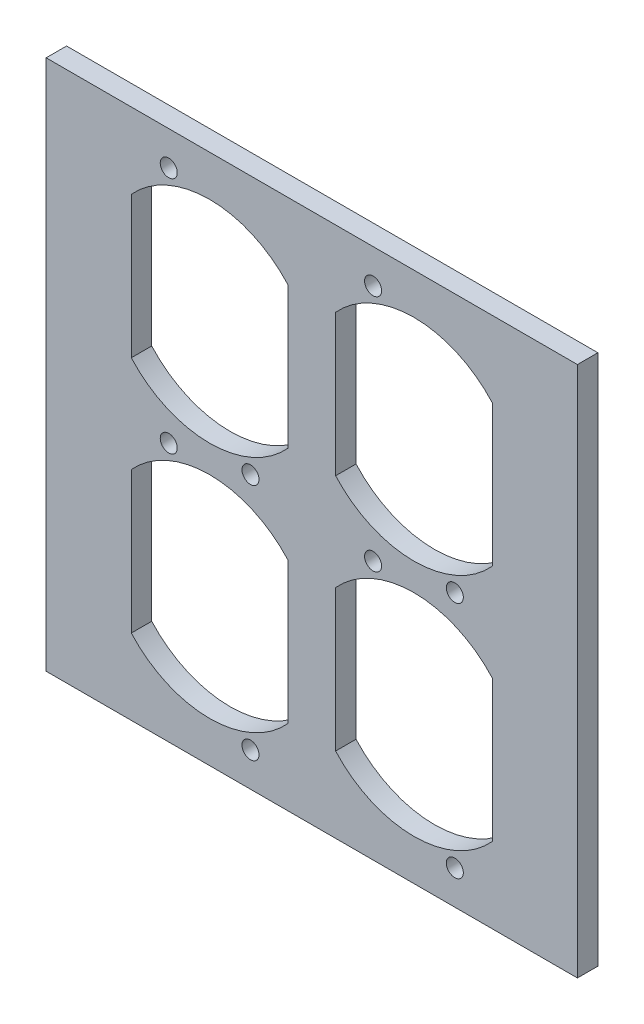
ISO-10303-21;
HEADER;
FILE_DESCRIPTION(('STEP AP214'),'2;1');
FILE_NAME('part.step','',(''),(''),'','','');
FILE_SCHEMA(('AUTOMOTIVE_DESIGN { 1 0 10303 214 1 1 1 1 }'));
ENDSEC;
DATA;
#1=APPLICATION_CONTEXT('core data for automotive mechanical design processes');
#2=APPLICATION_PROTOCOL_DEFINITION('international standard','automotive_design',2000,#1);
#3=PRODUCT_CONTEXT('',#1,'mechanical');
#4=PRODUCT('Part','Part','',(#3));
#5=PRODUCT_RELATED_PRODUCT_CATEGORY('part','',(#4));
#6=PRODUCT_DEFINITION_FORMATION('','',#4);
#7=PRODUCT_DEFINITION_CONTEXT('part definition',#1,'design');
#8=PRODUCT_DEFINITION('design','',#6,#7);
#9=PRODUCT_DEFINITION_SHAPE('','',#8);
#10=(LENGTH_UNIT() NAMED_UNIT(*) SI_UNIT(.MILLI.,.METRE.));
#11=(NAMED_UNIT(*) PLANE_ANGLE_UNIT() SI_UNIT($,.RADIAN.));
#12=(NAMED_UNIT(*) SI_UNIT($,.STERADIAN.) SOLID_ANGLE_UNIT());
#13=UNCERTAINTY_MEASURE_WITH_UNIT(LENGTH_MEASURE(1.E-05),#10,'distance_accuracy_value','');
#14=(GEOMETRIC_REPRESENTATION_CONTEXT(3) GLOBAL_UNCERTAINTY_ASSIGNED_CONTEXT((#13)) GLOBAL_UNIT_ASSIGNED_CONTEXT((#10,
#11,#12)) REPRESENTATION_CONTEXT('',''));
#15=CARTESIAN_POINT('',(0.,0.,0.));
#16=DIRECTION('',(0.,0.,1.));
#17=DIRECTION('',(1.,0.,0.));
#18=AXIS2_PLACEMENT_3D('',#15,#16,#17);
#19=CARTESIAN_POINT('',(39.,-39.,3.));
#20=DIRECTION('',(-1.,0.,0.));
#21=DIRECTION('',(0.,0.,1.));
#22=AXIS2_PLACEMENT_3D('',#19,#20,#21);
#23=PLANE('',#22);
#24=DIRECTION('',(0.,1.,0.));
#25=VECTOR('',#24,1.);
#26=CARTESIAN_POINT('',(39.,-39.,0.));
#27=LINE('',#26,#25);
#28=CARTESIAN_POINT('',(39.,-39.,0.));
#29=VERTEX_POINT('',#28);
#30=CARTESIAN_POINT('',(39.,39.,0.));
#31=VERTEX_POINT('',#30);
#32=EDGE_CURVE('E262',#29,#31,#27,.T.);
#33=ORIENTED_EDGE('',*,*,#32,.T.);
#34=DIRECTION('',(0.,0.,-1.));
#35=VECTOR('',#34,1.);
#36=CARTESIAN_POINT('',(39.,39.,3.));
#37=LINE('',#36,#35);
#38=CARTESIAN_POINT('',(39.,39.,3.));
#39=VERTEX_POINT('',#38);
#40=EDGE_CURVE('E295',#39,#31,#37,.T.);
#41=ORIENTED_EDGE('',*,*,#40,.F.);
#42=DIRECTION('',(0.,1.,0.));
#43=VECTOR('',#42,1.);
#44=CARTESIAN_POINT('',(39.,-39.,3.));
#45=LINE('',#44,#43);
#46=CARTESIAN_POINT('',(39.,-39.,3.));
#47=VERTEX_POINT('',#46);
#48=EDGE_CURVE('E269',#47,#39,#45,.T.);
#49=ORIENTED_EDGE('',*,*,#48,.F.);
#50=DIRECTION('',(0.,0.,-1.));
#51=VECTOR('',#50,1.);
#52=CARTESIAN_POINT('',(39.,-39.,3.));
#53=LINE('',#52,#51);
#54=EDGE_CURVE('E279',#47,#29,#53,.T.);
#55=ORIENTED_EDGE('',*,*,#54,.T.);
#56=EDGE_LOOP('',(#33,#41,#49,#55));
#57=FACE_BOUND('',#56,.T.);
#58=ADVANCED_FACE('F37',(#57),#23,.F.);
#59=CARTESIAN_POINT('',(-39.,39.,3.));
#60=DIRECTION('',(0.,-1.,0.));
#61=DIRECTION('',(0.,0.,-1.));
#62=AXIS2_PLACEMENT_3D('',#59,#60,#61);
#63=PLANE('',#62);
#64=DIRECTION('',(-1.,0.,0.));
#65=VECTOR('',#64,1.);
#66=CARTESIAN_POINT('',(-39.,39.,0.));
#67=LINE('',#66,#65);
#68=CARTESIAN_POINT('',(-39.,39.,0.));
#69=VERTEX_POINT('',#68);
#70=EDGE_CURVE('E282',#31,#69,#67,.T.);
#71=ORIENTED_EDGE('',*,*,#70,.T.);
#72=DIRECTION('',(0.,0.,-1.));
#73=VECTOR('',#72,1.);
#74=CARTESIAN_POINT('',(-39.,39.,3.));
#75=LINE('',#74,#73);
#76=CARTESIAN_POINT('',(-39.,39.,3.));
#77=VERTEX_POINT('',#76);
#78=EDGE_CURVE('E292',#77,#69,#75,.T.);
#79=ORIENTED_EDGE('',*,*,#78,.F.);
#80=DIRECTION('',(-1.,0.,0.));
#81=VECTOR('',#80,1.);
#82=CARTESIAN_POINT('',(-39.,39.,3.));
#83=LINE('',#82,#81);
#84=EDGE_CURVE('E272',#39,#77,#83,.T.);
#85=ORIENTED_EDGE('',*,*,#84,.F.);
#86=ORIENTED_EDGE('',*,*,#40,.T.);
#87=EDGE_LOOP('',(#71,#79,#85,#86));
#88=FACE_BOUND('',#87,.T.);
#89=ADVANCED_FACE('F377',(#88),#63,.F.);
#90=CARTESIAN_POINT('',(-39.,-39.,3.));
#91=DIRECTION('',(1.,0.,0.));
#92=DIRECTION('',(0.,0.,-1.));
#93=AXIS2_PLACEMENT_3D('',#90,#91,#92);
#94=PLANE('',#93);
#95=DIRECTION('',(0.,-1.,0.));
#96=VECTOR('',#95,1.);
#97=CARTESIAN_POINT('',(-39.,-39.,0.));
#98=LINE('',#97,#96);
#99=CARTESIAN_POINT('',(-39.,-39.,0.));
#100=VERTEX_POINT('',#99);
#101=EDGE_CURVE('E284',#69,#100,#98,.T.);
#102=ORIENTED_EDGE('',*,*,#101,.T.);
#103=DIRECTION('',(0.,0.,-1.));
#104=VECTOR('',#103,1.);
#105=CARTESIAN_POINT('',(-39.,-39.,3.));
#106=LINE('',#105,#104);
#107=CARTESIAN_POINT('',(-39.,-39.,3.));
#108=VERTEX_POINT('',#107);
#109=EDGE_CURVE('E289',#108,#100,#106,.T.);
#110=ORIENTED_EDGE('',*,*,#109,.F.);
#111=DIRECTION('',(0.,-1.,0.));
#112=VECTOR('',#111,1.);
#113=CARTESIAN_POINT('',(-39.,-39.,3.));
#114=LINE('',#113,#112);
#115=EDGE_CURVE('E275',#77,#108,#114,.T.);
#116=ORIENTED_EDGE('',*,*,#115,.F.);
#117=ORIENTED_EDGE('',*,*,#78,.T.);
#118=EDGE_LOOP('',(#102,#110,#116,#117));
#119=FACE_BOUND('',#118,.T.);
#120=ADVANCED_FACE('F383',(#119),#94,.F.);
#121=CARTESIAN_POINT('',(-39.,-39.,3.));
#122=DIRECTION('',(0.,1.,0.));
#123=DIRECTION('',(0.,0.,1.));
#124=AXIS2_PLACEMENT_3D('',#121,#122,#123);
#125=PLANE('',#124);
#126=DIRECTION('',(1.,0.,0.));
#127=VECTOR('',#126,1.);
#128=CARTESIAN_POINT('',(-39.,-39.,0.));
#129=LINE('',#128,#127);
#130=EDGE_CURVE('E273',#100,#29,#129,.T.);
#131=ORIENTED_EDGE('',*,*,#130,.T.);
#132=ORIENTED_EDGE('',*,*,#54,.F.);
#133=DIRECTION('',(1.,0.,0.));
#134=VECTOR('',#133,1.);
#135=CARTESIAN_POINT('',(-39.,-39.,3.));
#136=LINE('',#135,#134);
#137=EDGE_CURVE('E277',#108,#47,#136,.T.);
#138=ORIENTED_EDGE('',*,*,#137,.F.);
#139=ORIENTED_EDGE('',*,*,#109,.T.);
#140=EDGE_LOOP('',(#131,#132,#138,#139));
#141=FACE_BOUND('',#140,.T.);
#142=ADVANCED_FACE('F428',(#141),#125,.F.);
#143=CARTESIAN_POINT('',(0.,0.,3.));
#144=DIRECTION('',(0.,0.,-1.));
#145=DIRECTION('',(-1.,0.,0.));
#146=AXIS2_PLACEMENT_3D('',#143,#144,#145);
#147=PLANE('',#146);
#148=CARTESIAN_POINT('',(-21.,-1.,3.));
#149=DIRECTION('',(0.,0.,-1.));
#150=DIRECTION('',(-1.,0.,0.));
#151=AXIS2_PLACEMENT_3D('',#148,#149,#150);
#152=CIRCLE('',#151,1.25);
#153=CARTESIAN_POINT('',(-22.25,-1.,3.));
#154=VERTEX_POINT('',#153);
#155=EDGE_CURVE('E682',#154,#154,#152,.T.);
#156=ORIENTED_EDGE('',*,*,#155,.T.);
#157=EDGE_LOOP('',(#156));
#158=FACE_BOUND('',#157,.T.);
#159=CARTESIAN_POINT('',(-9.,-34.,3.));
#160=DIRECTION('',(0.,0.,-1.));
#161=DIRECTION('',(-1.,0.,0.));
#162=AXIS2_PLACEMENT_3D('',#159,#160,#161);
#163=CIRCLE('',#162,1.25);
#164=CARTESIAN_POINT('',(-10.25,-34.,3.));
#165=VERTEX_POINT('',#164);
#166=EDGE_CURVE('E689',#165,#165,#163,.T.);
#167=ORIENTED_EDGE('',*,*,#166,.T.);
#168=EDGE_LOOP('',(#167));
#169=FACE_BOUND('',#168,.T.);
#170=CARTESIAN_POINT('',(-21.,34.,3.));
#171=DIRECTION('',(0.,0.,-1.));
#172=DIRECTION('',(-1.,0.,0.));
#173=AXIS2_PLACEMENT_3D('',#170,#171,#172);
#174=CIRCLE('',#173,1.25);
#175=CARTESIAN_POINT('',(-22.25,34.,3.));
#176=VERTEX_POINT('',#175);
#177=EDGE_CURVE('E695',#176,#176,#174,.T.);
#178=ORIENTED_EDGE('',*,*,#177,.T.);
#179=EDGE_LOOP('',(#178));
#180=FACE_BOUND('',#179,.T.);
#181=CARTESIAN_POINT('',(-9.,1.,3.));
#182=DIRECTION('',(0.,0.,-1.));
#183=DIRECTION('',(-1.,0.,0.));
#184=AXIS2_PLACEMENT_3D('',#181,#182,#183);
#185=CIRCLE('',#184,1.25);
#186=CARTESIAN_POINT('',(-10.25,1.,3.));
#187=VERTEX_POINT('',#186);
#188=EDGE_CURVE('E701',#187,#187,#185,.T.);
#189=ORIENTED_EDGE('',*,*,#188,.T.);
#190=EDGE_LOOP('',(#189));
#191=FACE_BOUND('',#190,.T.);
#192=CARTESIAN_POINT('',(9.,-1.,3.));
#193=DIRECTION('',(0.,0.,-1.));
#194=DIRECTION('',(-1.,0.,0.));
#195=AXIS2_PLACEMENT_3D('',#192,#193,#194);
#196=CIRCLE('',#195,1.25);
#197=CARTESIAN_POINT('',(7.75,-1.,3.));
#198=VERTEX_POINT('',#197);
#199=EDGE_CURVE('E707',#198,#198,#196,.T.);
#200=ORIENTED_EDGE('',*,*,#199,.T.);
#201=EDGE_LOOP('',(#200));
#202=FACE_BOUND('',#201,.T.);
#203=CARTESIAN_POINT('',(21.,-34.,3.));
#204=DIRECTION('',(0.,0.,-1.));
#205=DIRECTION('',(-1.,0.,0.));
#206=AXIS2_PLACEMENT_3D('',#203,#204,#205);
#207=CIRCLE('',#206,1.25);
#208=CARTESIAN_POINT('',(19.75,-34.,3.));
#209=VERTEX_POINT('',#208);
#210=EDGE_CURVE('E188',#209,#209,#207,.T.);
#211=ORIENTED_EDGE('',*,*,#210,.T.);
#212=EDGE_LOOP('',(#211));
#213=FACE_BOUND('',#212,.T.);
#214=DIRECTION('',(0.,1.,0.));
#215=VECTOR('',#214,1.);
#216=CARTESIAN_POINT('',(-26.5,27.8923048454133,3.));
#217=LINE('',#216,#215);
#218=CARTESIAN_POINT('',(-26.5,7.10769515458674,3.));
#219=VERTEX_POINT('',#218);
#220=CARTESIAN_POINT('',(-26.5,27.8923048454133,3.));
#221=VERTEX_POINT('',#220);
#222=EDGE_CURVE('E211',#219,#221,#217,.T.);
#223=ORIENTED_EDGE('',*,*,#222,.T.);
#224=CARTESIAN_POINT('',(-15.,17.5,3.));
#225=DIRECTION('',(0.,0.,-1.));
#226=DIRECTION('',(1.,0.,0.));
#227=AXIS2_PLACEMENT_3D('',#224,#225,#226);
#228=CIRCLE('',#227,15.5);
#229=CARTESIAN_POINT('',(-3.5,27.8923048454133,3.));
#230=VERTEX_POINT('',#229);
#231=EDGE_CURVE('E217',#221,#230,#228,.T.);
#232=ORIENTED_EDGE('',*,*,#231,.T.);
#233=DIRECTION('',(0.,-1.,0.));
#234=VECTOR('',#233,1.);
#235=CARTESIAN_POINT('',(-3.5,27.8923048454133,3.));
#236=LINE('',#235,#234);
#237=CARTESIAN_POINT('',(-3.5,7.10769515458673,3.));
#238=VERTEX_POINT('',#237);
#239=EDGE_CURVE('E187',#230,#238,#236,.T.);
#240=ORIENTED_EDGE('',*,*,#239,.T.);
#241=CARTESIAN_POINT('',(-15.,17.5,3.));
#242=DIRECTION('',(0.,0.,-1.));
#243=DIRECTION('',(-1.,0.,0.));
#244=AXIS2_PLACEMENT_3D('',#241,#242,#243);
#245=CIRCLE('',#244,15.5);
#246=EDGE_CURVE('E195',#238,#219,#245,.T.);
#247=ORIENTED_EDGE('',*,*,#246,.T.);
#248=EDGE_LOOP('',(#223,#232,#240,#247));
#249=FACE_BOUND('',#248,.T.);
#250=CARTESIAN_POINT('',(9.,34.,3.));
#251=DIRECTION('',(0.,0.,-1.));
#252=DIRECTION('',(-1.,0.,0.));
#253=AXIS2_PLACEMENT_3D('',#250,#251,#252);
#254=CIRCLE('',#253,1.25);
#255=CARTESIAN_POINT('',(7.75,34.,3.));
#256=VERTEX_POINT('',#255);
#257=EDGE_CURVE('E221',#256,#256,#254,.T.);
#258=ORIENTED_EDGE('',*,*,#257,.T.);
#259=EDGE_LOOP('',(#258));
#260=FACE_BOUND('',#259,.T.);
#261=CARTESIAN_POINT('',(21.,1.,3.));
#262=DIRECTION('',(0.,0.,-1.));
#263=DIRECTION('',(-1.,0.,0.));
#264=AXIS2_PLACEMENT_3D('',#261,#262,#263);
#265=CIRCLE('',#264,1.25);
#266=CARTESIAN_POINT('',(19.75,1.,3.));
#267=VERTEX_POINT('',#266);
#268=EDGE_CURVE('E227',#267,#267,#265,.T.);
#269=ORIENTED_EDGE('',*,*,#268,.T.);
#270=EDGE_LOOP('',(#269));
#271=FACE_BOUND('',#270,.T.);
#272=DIRECTION('',(0.,1.,0.));
#273=VECTOR('',#272,1.);
#274=CARTESIAN_POINT('',(3.5,27.8923048454133,3.));
#275=LINE('',#274,#273);
#276=CARTESIAN_POINT('',(3.5,7.10769515458674,3.));
#277=VERTEX_POINT('',#276);
#278=CARTESIAN_POINT('',(3.5,27.8923048454133,3.));
#279=VERTEX_POINT('',#278);
#280=EDGE_CURVE('E245',#277,#279,#275,.T.);
#281=ORIENTED_EDGE('',*,*,#280,.T.);
#282=CARTESIAN_POINT('',(15.,17.5,3.));
#283=DIRECTION('',(0.,0.,-1.));
#284=DIRECTION('',(1.,0.,0.));
#285=AXIS2_PLACEMENT_3D('',#282,#283,#284);
#286=CIRCLE('',#285,15.5);
#287=CARTESIAN_POINT('',(26.5,27.8923048454133,3.));
#288=VERTEX_POINT('',#287);
#289=EDGE_CURVE('E233',#279,#288,#286,.T.);
#290=ORIENTED_EDGE('',*,*,#289,.T.);
#291=DIRECTION('',(0.,-1.,0.));
#292=VECTOR('',#291,1.);
#293=CARTESIAN_POINT('',(26.5,27.8923048454133,3.));
#294=LINE('',#293,#292);
#295=CARTESIAN_POINT('',(26.5,7.10769515458673,3.));
#296=VERTEX_POINT('',#295);
#297=EDGE_CURVE('E237',#288,#296,#294,.T.);
#298=ORIENTED_EDGE('',*,*,#297,.T.);
#299=CARTESIAN_POINT('',(15.,17.5,3.));
#300=DIRECTION('',(0.,0.,-1.));
#301=DIRECTION('',(-1.,0.,0.));
#302=AXIS2_PLACEMENT_3D('',#299,#300,#301);
#303=CIRCLE('',#302,15.5);
#304=EDGE_CURVE('E242',#296,#277,#303,.T.);
#305=ORIENTED_EDGE('',*,*,#304,.T.);
#306=EDGE_LOOP('',(#281,#290,#298,#305));
#307=FACE_BOUND('',#306,.T.);
#308=ORIENTED_EDGE('',*,*,#48,.T.);
#309=ORIENTED_EDGE('',*,*,#84,.T.);
#310=ORIENTED_EDGE('',*,*,#115,.T.);
#311=ORIENTED_EDGE('',*,*,#137,.T.);
#312=EDGE_LOOP('',(#308,#309,#310,#311));
#313=FACE_BOUND('',#312,.T.);
#314=CARTESIAN_POINT('',(15.,-17.5,3.));
#315=DIRECTION('',(0.,0.,-1.));
#316=DIRECTION('',(1.,0.,0.));
#317=AXIS2_PLACEMENT_3D('',#314,#315,#316);
#318=CIRCLE('',#317,15.5);
#319=CARTESIAN_POINT('',(3.5,-7.10769515458673,3.));
#320=VERTEX_POINT('',#319);
#321=CARTESIAN_POINT('',(26.5,-7.10769515458674,3.));
#322=VERTEX_POINT('',#321);
#323=EDGE_CURVE('E309',#320,#322,#318,.T.);
#324=ORIENTED_EDGE('',*,*,#323,.T.);
#325=DIRECTION('',(0.,-1.,0.));
#326=VECTOR('',#325,1.);
#327=CARTESIAN_POINT('',(26.5,-7.10769515458674,3.));
#328=LINE('',#327,#326);
#329=CARTESIAN_POINT('',(26.5,-27.8923048454133,3.));
#330=VERTEX_POINT('',#329);
#331=EDGE_CURVE('E311',#322,#330,#328,.T.);
#332=ORIENTED_EDGE('',*,*,#331,.T.);
#333=CARTESIAN_POINT('',(15.,-17.5,3.));
#334=DIRECTION('',(0.,0.,-1.));
#335=DIRECTION('',(-1.,0.,0.));
#336=AXIS2_PLACEMENT_3D('',#333,#334,#335);
#337=CIRCLE('',#336,15.5);
#338=CARTESIAN_POINT('',(3.5,-27.8923048454133,3.));
#339=VERTEX_POINT('',#338);
#340=EDGE_CURVE('E313',#330,#339,#337,.T.);
#341=ORIENTED_EDGE('',*,*,#340,.T.);
#342=DIRECTION('',(0.,1.,0.));
#343=VECTOR('',#342,1.);
#344=CARTESIAN_POINT('',(3.5,-7.10769515458673,3.));
#345=LINE('',#344,#343);
#346=EDGE_CURVE('E315',#339,#320,#345,.T.);
#347=ORIENTED_EDGE('',*,*,#346,.T.);
#348=EDGE_LOOP('',(#324,#332,#341,#347));
#349=FACE_BOUND('',#348,.T.);
#350=CARTESIAN_POINT('',(-15.,-17.5,3.));
#351=DIRECTION('',(0.,0.,-1.));
#352=DIRECTION('',(1.,0.,0.));
#353=AXIS2_PLACEMENT_3D('',#350,#351,#352);
#354=CIRCLE('',#353,15.5);
#355=CARTESIAN_POINT('',(-26.5,-7.10769515458673,3.));
#356=VERTEX_POINT('',#355);
#357=CARTESIAN_POINT('',(-3.5,-7.10769515458674,3.));
#358=VERTEX_POINT('',#357);
#359=EDGE_CURVE('E52',#356,#358,#354,.T.);
#360=ORIENTED_EDGE('',*,*,#359,.T.);
#361=DIRECTION('',(0.,-1.,0.));
#362=VECTOR('',#361,1.);
#363=CARTESIAN_POINT('',(-3.5,-7.10769515458674,3.));
#364=LINE('',#363,#362);
#365=CARTESIAN_POINT('',(-3.5,-27.8923048454133,3.));
#366=VERTEX_POINT('',#365);
#367=EDGE_CURVE('E342',#358,#366,#364,.T.);
#368=ORIENTED_EDGE('',*,*,#367,.T.);
#369=CARTESIAN_POINT('',(-15.,-17.5,3.));
#370=DIRECTION('',(0.,0.,-1.));
#371=DIRECTION('',(-1.,0.,0.));
#372=AXIS2_PLACEMENT_3D('',#369,#370,#371);
#373=CIRCLE('',#372,15.5);
#374=CARTESIAN_POINT('',(-26.5,-27.8923048454133,3.));
#375=VERTEX_POINT('',#374);
#376=EDGE_CURVE('E59',#366,#375,#373,.T.);
#377=ORIENTED_EDGE('',*,*,#376,.T.);
#378=DIRECTION('',(0.,1.,0.));
#379=VECTOR('',#378,1.);
#380=CARTESIAN_POINT('',(-26.5,-7.10769515458673,3.));
#381=LINE('',#380,#379);
#382=EDGE_CURVE('E345',#375,#356,#381,.T.);
#383=ORIENTED_EDGE('',*,*,#382,.T.);
#384=EDGE_LOOP('',(#360,#368,#377,#383));
#385=FACE_BOUND('',#384,.T.);
#386=ADVANCED_FACE('F415',(#158,#169,#180,#191,#202,#213,#249,#260,#271,#307,#313,#349,#385),
#147,.F.);
#387=CARTESIAN_POINT('',(0.,0.,0.));
#388=DIRECTION('',(0.,0.,-1.));
#389=DIRECTION('',(-1.,0.,0.));
#390=AXIS2_PLACEMENT_3D('',#387,#388,#389);
#391=PLANE('',#390);
#392=CARTESIAN_POINT('',(-21.,-1.,0.));
#393=DIRECTION('',(0.,0.,-1.));
#394=DIRECTION('',(-1.,0.,0.));
#395=AXIS2_PLACEMENT_3D('',#392,#393,#394);
#396=CIRCLE('',#395,1.25);
#397=CARTESIAN_POINT('',(-22.25,-1.,0.));
#398=VERTEX_POINT('',#397);
#399=EDGE_CURVE('E684',#398,#398,#396,.T.);
#400=ORIENTED_EDGE('',*,*,#399,.F.);
#401=EDGE_LOOP('',(#400));
#402=FACE_BOUND('',#401,.T.);
#403=CARTESIAN_POINT('',(-9.,-34.,0.));
#404=DIRECTION('',(0.,0.,-1.));
#405=DIRECTION('',(-1.,0.,0.));
#406=AXIS2_PLACEMENT_3D('',#403,#404,#405);
#407=CIRCLE('',#406,1.25);
#408=CARTESIAN_POINT('',(-10.25,-34.,0.));
#409=VERTEX_POINT('',#408);
#410=EDGE_CURVE('E686',#409,#409,#407,.T.);
#411=ORIENTED_EDGE('',*,*,#410,.F.);
#412=EDGE_LOOP('',(#411));
#413=FACE_BOUND('',#412,.T.);
#414=CARTESIAN_POINT('',(-21.,34.,0.));
#415=DIRECTION('',(0.,0.,-1.));
#416=DIRECTION('',(-1.,0.,0.));
#417=AXIS2_PLACEMENT_3D('',#414,#415,#416);
#418=CIRCLE('',#417,1.25);
#419=CARTESIAN_POINT('',(-22.25,34.,0.));
#420=VERTEX_POINT('',#419);
#421=EDGE_CURVE('E692',#420,#420,#418,.T.);
#422=ORIENTED_EDGE('',*,*,#421,.F.);
#423=EDGE_LOOP('',(#422));
#424=FACE_BOUND('',#423,.T.);
#425=CARTESIAN_POINT('',(-9.,1.,0.));
#426=DIRECTION('',(0.,0.,-1.));
#427=DIRECTION('',(-1.,0.,0.));
#428=AXIS2_PLACEMENT_3D('',#425,#426,#427);
#429=CIRCLE('',#428,1.25);
#430=CARTESIAN_POINT('',(-10.25,1.,0.));
#431=VERTEX_POINT('',#430);
#432=EDGE_CURVE('E698',#431,#431,#429,.T.);
#433=ORIENTED_EDGE('',*,*,#432,.F.);
#434=EDGE_LOOP('',(#433));
#435=FACE_BOUND('',#434,.T.);
#436=CARTESIAN_POINT('',(9.,-1.,0.));
#437=DIRECTION('',(0.,0.,-1.));
#438=DIRECTION('',(-1.,0.,0.));
#439=AXIS2_PLACEMENT_3D('',#436,#437,#438);
#440=CIRCLE('',#439,1.25);
#441=CARTESIAN_POINT('',(7.75,-1.,0.));
#442=VERTEX_POINT('',#441);
#443=EDGE_CURVE('E704',#442,#442,#440,.T.);
#444=ORIENTED_EDGE('',*,*,#443,.F.);
#445=EDGE_LOOP('',(#444));
#446=FACE_BOUND('',#445,.T.);
#447=CARTESIAN_POINT('',(21.,-34.,0.));
#448=DIRECTION('',(0.,0.,-1.));
#449=DIRECTION('',(-1.,0.,0.));
#450=AXIS2_PLACEMENT_3D('',#447,#448,#449);
#451=CIRCLE('',#450,1.25);
#452=CARTESIAN_POINT('',(19.75,-34.,0.));
#453=VERTEX_POINT('',#452);
#454=EDGE_CURVE('E710',#453,#453,#451,.T.);
#455=ORIENTED_EDGE('',*,*,#454,.F.);
#456=EDGE_LOOP('',(#455));
#457=FACE_BOUND('',#456,.T.);
#458=CARTESIAN_POINT('',(-15.,17.5,0.));
#459=DIRECTION('',(0.,0.,-1.));
#460=DIRECTION('',(1.,0.,0.));
#461=AXIS2_PLACEMENT_3D('',#458,#459,#460);
#462=CIRCLE('',#461,15.5);
#463=CARTESIAN_POINT('',(-26.5,27.8923048454133,0.));
#464=VERTEX_POINT('',#463);
#465=CARTESIAN_POINT('',(-3.5,27.8923048454133,0.));
#466=VERTEX_POINT('',#465);
#467=EDGE_CURVE('E214',#464,#466,#462,.T.);
#468=ORIENTED_EDGE('',*,*,#467,.F.);
#469=DIRECTION('',(0.,1.,0.));
#470=VECTOR('',#469,1.);
#471=CARTESIAN_POINT('',(-26.5,27.8923048454133,0.));
#472=LINE('',#471,#470);
#473=CARTESIAN_POINT('',(-26.5,7.10769515458674,0.));
#474=VERTEX_POINT('',#473);
#475=EDGE_CURVE('E200',#474,#464,#472,.T.);
#476=ORIENTED_EDGE('',*,*,#475,.F.);
#477=CARTESIAN_POINT('',(-15.,17.5,0.));
#478=DIRECTION('',(0.,0.,-1.));
#479=DIRECTION('',(-1.,0.,0.));
#480=AXIS2_PLACEMENT_3D('',#477,#478,#479);
#481=CIRCLE('',#480,15.5);
#482=CARTESIAN_POINT('',(-3.5,7.10769515458673,0.));
#483=VERTEX_POINT('',#482);
#484=EDGE_CURVE('E192',#483,#474,#481,.T.);
#485=ORIENTED_EDGE('',*,*,#484,.F.);
#486=DIRECTION('',(0.,-1.,0.));
#487=VECTOR('',#486,1.);
#488=CARTESIAN_POINT('',(-3.5,27.8923048454133,0.));
#489=LINE('',#488,#487);
#490=EDGE_CURVE('E176',#466,#483,#489,.T.);
#491=ORIENTED_EDGE('',*,*,#490,.F.);
#492=EDGE_LOOP('',(#468,#476,#485,#491));
#493=FACE_BOUND('',#492,.T.);
#494=CARTESIAN_POINT('',(9.,34.,0.));
#495=DIRECTION('',(0.,0.,-1.));
#496=DIRECTION('',(-1.,0.,0.));
#497=AXIS2_PLACEMENT_3D('',#494,#495,#496);
#498=CIRCLE('',#497,1.25);
#499=CARTESIAN_POINT('',(7.75,34.,0.));
#500=VERTEX_POINT('',#499);
#501=EDGE_CURVE('E220',#500,#500,#498,.T.);
#502=ORIENTED_EDGE('',*,*,#501,.F.);
#503=EDGE_LOOP('',(#502));
#504=FACE_BOUND('',#503,.T.);
#505=CARTESIAN_POINT('',(21.,1.,0.));
#506=DIRECTION('',(0.,0.,-1.));
#507=DIRECTION('',(-1.,0.,0.));
#508=AXIS2_PLACEMENT_3D('',#505,#506,#507);
#509=CIRCLE('',#508,1.25);
#510=CARTESIAN_POINT('',(19.75,1.,0.));
#511=VERTEX_POINT('',#510);
#512=EDGE_CURVE('E224',#511,#511,#509,.T.);
#513=ORIENTED_EDGE('',*,*,#512,.F.);
#514=EDGE_LOOP('',(#513));
#515=FACE_BOUND('',#514,.T.);
#516=CARTESIAN_POINT('',(15.,17.5,0.));
#517=DIRECTION('',(0.,0.,-1.));
#518=DIRECTION('',(1.,0.,0.));
#519=AXIS2_PLACEMENT_3D('',#516,#517,#518);
#520=CIRCLE('',#519,15.5);
#521=CARTESIAN_POINT('',(3.5,27.8923048454133,0.));
#522=VERTEX_POINT('',#521);
#523=CARTESIAN_POINT('',(26.5,27.8923048454133,0.));
#524=VERTEX_POINT('',#523);
#525=EDGE_CURVE('E230',#522,#524,#520,.T.);
#526=ORIENTED_EDGE('',*,*,#525,.F.);
#527=DIRECTION('',(0.,1.,0.));
#528=VECTOR('',#527,1.);
#529=CARTESIAN_POINT('',(3.5,27.8923048454133,0.));
#530=LINE('',#529,#528);
#531=CARTESIAN_POINT('',(3.5,7.10769515458674,0.));
#532=VERTEX_POINT('',#531);
#533=EDGE_CURVE('E238',#532,#522,#530,.T.);
#534=ORIENTED_EDGE('',*,*,#533,.F.);
#535=CARTESIAN_POINT('',(15.,17.5,0.));
#536=DIRECTION('',(0.,0.,-1.));
#537=DIRECTION('',(-1.,0.,0.));
#538=AXIS2_PLACEMENT_3D('',#535,#536,#537);
#539=CIRCLE('',#538,15.5);
#540=CARTESIAN_POINT('',(26.5,7.10769515458673,0.));
#541=VERTEX_POINT('',#540);
#542=EDGE_CURVE('E254',#541,#532,#539,.T.);
#543=ORIENTED_EDGE('',*,*,#542,.F.);
#544=DIRECTION('',(0.,-1.,0.));
#545=VECTOR('',#544,1.);
#546=CARTESIAN_POINT('',(26.5,27.8923048454133,0.));
#547=LINE('',#546,#545);
#548=EDGE_CURVE('E251',#524,#541,#547,.T.);
#549=ORIENTED_EDGE('',*,*,#548,.F.);
#550=EDGE_LOOP('',(#526,#534,#543,#549));
#551=FACE_BOUND('',#550,.T.);
#552=ORIENTED_EDGE('',*,*,#32,.F.);
#553=ORIENTED_EDGE('',*,*,#130,.F.);
#554=ORIENTED_EDGE('',*,*,#101,.F.);
#555=ORIENTED_EDGE('',*,*,#70,.F.);
#556=EDGE_LOOP('',(#552,#553,#554,#555));
#557=FACE_BOUND('',#556,.T.);
#558=CARTESIAN_POINT('',(15.,-17.5,0.));
#559=DIRECTION('',(0.,0.,-1.));
#560=DIRECTION('',(1.,0.,0.));
#561=AXIS2_PLACEMENT_3D('',#558,#559,#560);
#562=CIRCLE('',#561,15.5);
#563=CARTESIAN_POINT('',(3.5,-7.10769515458673,0.));
#564=VERTEX_POINT('',#563);
#565=CARTESIAN_POINT('',(26.5,-7.10769515458674,0.));
#566=VERTEX_POINT('',#565);
#567=EDGE_CURVE('E298',#564,#566,#562,.T.);
#568=ORIENTED_EDGE('',*,*,#567,.F.);
#569=DIRECTION('',(0.,1.,0.));
#570=VECTOR('',#569,1.);
#571=CARTESIAN_POINT('',(3.5,-7.10769515458673,0.));
#572=LINE('',#571,#570);
#573=CARTESIAN_POINT('',(3.5,-27.8923048454133,0.));
#574=VERTEX_POINT('',#573);
#575=EDGE_CURVE('E300',#574,#564,#572,.T.);
#576=ORIENTED_EDGE('',*,*,#575,.F.);
#577=CARTESIAN_POINT('',(15.,-17.5,0.));
#578=DIRECTION('',(0.,0.,-1.));
#579=DIRECTION('',(-1.,0.,0.));
#580=AXIS2_PLACEMENT_3D('',#577,#578,#579);
#581=CIRCLE('',#580,15.5);
#582=CARTESIAN_POINT('',(26.5,-27.8923048454133,0.));
#583=VERTEX_POINT('',#582);
#584=EDGE_CURVE('E303',#583,#574,#581,.T.);
#585=ORIENTED_EDGE('',*,*,#584,.F.);
#586=DIRECTION('',(0.,-1.,0.));
#587=VECTOR('',#586,1.);
#588=CARTESIAN_POINT('',(26.5,-7.10769515458674,0.));
#589=LINE('',#588,#587);
#590=EDGE_CURVE('E306',#566,#583,#589,.T.);
#591=ORIENTED_EDGE('',*,*,#590,.F.);
#592=EDGE_LOOP('',(#568,#576,#585,#591));
#593=FACE_BOUND('',#592,.T.);
#594=CARTESIAN_POINT('',(-15.,-17.5,0.));
#595=DIRECTION('',(0.,0.,-1.));
#596=DIRECTION('',(1.,0.,0.));
#597=AXIS2_PLACEMENT_3D('',#594,#595,#596);
#598=CIRCLE('',#597,15.5);
#599=CARTESIAN_POINT('',(-26.5,-7.10769515458673,0.));
#600=VERTEX_POINT('',#599);
#601=CARTESIAN_POINT('',(-3.5,-7.10769515458674,0.));
#602=VERTEX_POINT('',#601);
#603=EDGE_CURVE('E330',#600,#602,#598,.T.);
#604=ORIENTED_EDGE('',*,*,#603,.F.);
#605=DIRECTION('',(0.,1.,0.));
#606=VECTOR('',#605,1.);
#607=CARTESIAN_POINT('',(-26.5,-7.10769515458673,0.));
#608=LINE('',#607,#606);
#609=CARTESIAN_POINT('',(-26.5,-27.8923048454133,0.));
#610=VERTEX_POINT('',#609);
#611=EDGE_CURVE('E332',#610,#600,#608,.T.);
#612=ORIENTED_EDGE('',*,*,#611,.F.);
#613=CARTESIAN_POINT('',(-15.,-17.5,0.));
#614=DIRECTION('',(0.,0.,-1.));
#615=DIRECTION('',(-1.,0.,0.));
#616=AXIS2_PLACEMENT_3D('',#613,#614,#615);
#617=CIRCLE('',#616,15.5);
#618=CARTESIAN_POINT('',(-3.5,-27.8923048454133,0.));
#619=VERTEX_POINT('',#618);
#620=EDGE_CURVE('E335',#619,#610,#617,.T.);
#621=ORIENTED_EDGE('',*,*,#620,.F.);
#622=DIRECTION('',(0.,-1.,0.));
#623=VECTOR('',#622,1.);
#624=CARTESIAN_POINT('',(-3.5,-7.10769515458674,0.));
#625=LINE('',#624,#623);
#626=EDGE_CURVE('E338',#602,#619,#625,.T.);
#627=ORIENTED_EDGE('',*,*,#626,.F.);
#628=EDGE_LOOP('',(#604,#612,#621,#627));
#629=FACE_BOUND('',#628,.T.);
#630=ADVANCED_FACE('F198',(#402,#413,#424,#435,#446,#457,#493,#504,#515,#551,#557,#593,#629),
#391,.T.);
#631=CARTESIAN_POINT('',(15.,17.5,3.));
#632=DIRECTION('',(0.,0.,-1.));
#633=DIRECTION('',(-1.,0.,0.));
#634=AXIS2_PLACEMENT_3D('',#631,#632,#633);
#635=CYLINDRICAL_SURFACE('',#634,15.5);
#636=ORIENTED_EDGE('',*,*,#525,.T.);
#637=DIRECTION('',(0.,0.,-1.));
#638=VECTOR('',#637,1.);
#639=CARTESIAN_POINT('',(26.5,27.8923048454133,3.));
#640=LINE('',#639,#638);
#641=EDGE_CURVE('E249',#288,#524,#640,.T.);
#642=ORIENTED_EDGE('',*,*,#641,.F.);
#643=ORIENTED_EDGE('',*,*,#289,.F.);
#644=DIRECTION('',(0.,0.,-1.));
#645=VECTOR('',#644,1.);
#646=CARTESIAN_POINT('',(3.5,27.8923048454133,3.));
#647=LINE('',#646,#645);
#648=EDGE_CURVE('E260',#279,#522,#647,.T.);
#649=ORIENTED_EDGE('',*,*,#648,.T.);
#650=EDGE_LOOP('',(#636,#642,#643,#649));
#651=FACE_BOUND('',#650,.T.);
#652=ADVANCED_FACE('F418',(#651),#635,.F.);
#653=CARTESIAN_POINT('',(3.5,27.8923048454133,3.));
#654=DIRECTION('',(-1.,0.,0.));
#655=DIRECTION('',(0.,0.,1.));
#656=AXIS2_PLACEMENT_3D('',#653,#654,#655);
#657=PLANE('',#656);
#658=ORIENTED_EDGE('',*,*,#533,.T.);
#659=ORIENTED_EDGE('',*,*,#648,.F.);
#660=ORIENTED_EDGE('',*,*,#280,.F.);
#661=DIRECTION('',(0.,0.,-1.));
#662=VECTOR('',#661,1.);
#663=CARTESIAN_POINT('',(3.5,7.10769515458674,3.));
#664=LINE('',#663,#662);
#665=EDGE_CURVE('E263',#277,#532,#664,.T.);
#666=ORIENTED_EDGE('',*,*,#665,.T.);
#667=EDGE_LOOP('',(#658,#659,#660,#666));
#668=FACE_BOUND('',#667,.T.);
#669=ADVANCED_FACE('F425',(#668),#657,.F.);
#670=CARTESIAN_POINT('',(15.,17.5,3.));
#671=DIRECTION('',(0.,0.,-1.));
#672=DIRECTION('',(-1.,0.,0.));
#673=AXIS2_PLACEMENT_3D('',#670,#671,#672);
#674=CYLINDRICAL_SURFACE('',#673,15.5);
#675=ORIENTED_EDGE('',*,*,#542,.T.);
#676=ORIENTED_EDGE('',*,*,#665,.F.);
#677=ORIENTED_EDGE('',*,*,#304,.F.);
#678=DIRECTION('',(0.,0.,-1.));
#679=VECTOR('',#678,1.);
#680=CARTESIAN_POINT('',(26.5,7.10769515458673,3.));
#681=LINE('',#680,#679);
#682=EDGE_CURVE('E265',#296,#541,#681,.T.);
#683=ORIENTED_EDGE('',*,*,#682,.T.);
#684=EDGE_LOOP('',(#675,#676,#677,#683));
#685=FACE_BOUND('',#684,.T.);
#686=ADVANCED_FACE('F623',(#685),#674,.F.);
#687=CARTESIAN_POINT('',(26.5,27.8923048454133,3.));
#688=DIRECTION('',(1.,0.,0.));
#689=DIRECTION('',(0.,0.,-1.));
#690=AXIS2_PLACEMENT_3D('',#687,#688,#689);
#691=PLANE('',#690);
#692=ORIENTED_EDGE('',*,*,#548,.T.);
#693=ORIENTED_EDGE('',*,*,#682,.F.);
#694=ORIENTED_EDGE('',*,*,#297,.F.);
#695=ORIENTED_EDGE('',*,*,#641,.T.);
#696=EDGE_LOOP('',(#692,#693,#694,#695));
#697=FACE_BOUND('',#696,.T.);
#698=ADVANCED_FACE('F619',(#697),#691,.F.);
#699=CARTESIAN_POINT('',(21.,1.,3.));
#700=DIRECTION('',(0.,0.,-1.));
#701=DIRECTION('',(-1.,0.,0.));
#702=AXIS2_PLACEMENT_3D('',#699,#700,#701);
#703=CYLINDRICAL_SURFACE('',#702,1.25);
#704=ORIENTED_EDGE('',*,*,#268,.F.);
#705=EDGE_LOOP('',(#704));
#706=FACE_BOUND('',#705,.T.);
#707=ORIENTED_EDGE('',*,*,#512,.T.);
#708=EDGE_LOOP('',(#707));
#709=FACE_BOUND('',#708,.T.);
#710=ADVANCED_FACE('F615',(#706,#709),#703,.F.);
#711=CARTESIAN_POINT('',(9.,34.,3.));
#712=DIRECTION('',(0.,0.,-1.));
#713=DIRECTION('',(-1.,0.,0.));
#714=AXIS2_PLACEMENT_3D('',#711,#712,#713);
#715=CYLINDRICAL_SURFACE('',#714,1.25);
#716=ORIENTED_EDGE('',*,*,#257,.F.);
#717=EDGE_LOOP('',(#716));
#718=FACE_BOUND('',#717,.T.);
#719=ORIENTED_EDGE('',*,*,#501,.T.);
#720=EDGE_LOOP('',(#719));
#721=FACE_BOUND('',#720,.T.);
#722=ADVANCED_FACE('F480',(#718,#721),#715,.F.);
#723=CARTESIAN_POINT('',(-15.,17.5,3.));
#724=DIRECTION('',(0.,0.,-1.));
#725=DIRECTION('',(-1.,0.,0.));
#726=AXIS2_PLACEMENT_3D('',#723,#724,#725);
#727=CYLINDRICAL_SURFACE('',#726,15.5);
#728=ORIENTED_EDGE('',*,*,#467,.T.);
#729=DIRECTION('',(0.,0.,-1.));
#730=VECTOR('',#729,1.);
#731=CARTESIAN_POINT('',(-3.5,27.8923048454133,3.));
#732=LINE('',#731,#730);
#733=EDGE_CURVE('E182',#230,#466,#732,.T.);
#734=ORIENTED_EDGE('',*,*,#733,.F.);
#735=ORIENTED_EDGE('',*,*,#231,.F.);
#736=DIRECTION('',(0.,0.,-1.));
#737=VECTOR('',#736,1.);
#738=CARTESIAN_POINT('',(-26.5,27.8923048454133,3.));
#739=LINE('',#738,#737);
#740=EDGE_CURVE('E208',#221,#464,#739,.T.);
#741=ORIENTED_EDGE('',*,*,#740,.T.);
#742=EDGE_LOOP('',(#728,#734,#735,#741));
#743=FACE_BOUND('',#742,.T.);
#744=ADVANCED_FACE('F474',(#743),#727,.F.);
#745=CARTESIAN_POINT('',(-26.5,27.8923048454133,3.));
#746=DIRECTION('',(-1.,0.,0.));
#747=DIRECTION('',(0.,0.,1.));
#748=AXIS2_PLACEMENT_3D('',#745,#746,#747);
#749=PLANE('',#748);
#750=ORIENTED_EDGE('',*,*,#475,.T.);
#751=ORIENTED_EDGE('',*,*,#740,.F.);
#752=ORIENTED_EDGE('',*,*,#222,.F.);
#753=DIRECTION('',(0.,0.,-1.));
#754=VECTOR('',#753,1.);
#755=CARTESIAN_POINT('',(-26.5,7.10769515458674,3.));
#756=LINE('',#755,#754);
#757=EDGE_CURVE('E201',#219,#474,#756,.T.);
#758=ORIENTED_EDGE('',*,*,#757,.T.);
#759=EDGE_LOOP('',(#750,#751,#752,#758));
#760=FACE_BOUND('',#759,.T.);
#761=ADVANCED_FACE('F479',(#760),#749,.F.);
#762=CARTESIAN_POINT('',(-15.,17.5,3.));
#763=DIRECTION('',(0.,0.,-1.));
#764=DIRECTION('',(-1.,0.,0.));
#765=AXIS2_PLACEMENT_3D('',#762,#763,#764);
#766=CYLINDRICAL_SURFACE('',#765,15.5);
#767=ORIENTED_EDGE('',*,*,#484,.T.);
#768=ORIENTED_EDGE('',*,*,#757,.F.);
#769=ORIENTED_EDGE('',*,*,#246,.F.);
#770=DIRECTION('',(0.,0.,-1.));
#771=VECTOR('',#770,1.);
#772=CARTESIAN_POINT('',(-3.5,7.10769515458673,3.));
#773=LINE('',#772,#771);
#774=EDGE_CURVE('E179',#238,#483,#773,.T.);
#775=ORIENTED_EDGE('',*,*,#774,.T.);
#776=EDGE_LOOP('',(#767,#768,#769,#775));
#777=FACE_BOUND('',#776,.T.);
#778=ADVANCED_FACE('F191',(#777),#766,.F.);
#779=CARTESIAN_POINT('',(-3.5,27.8923048454133,3.));
#780=DIRECTION('',(1.,0.,0.));
#781=DIRECTION('',(0.,0.,-1.));
#782=AXIS2_PLACEMENT_3D('',#779,#780,#781);
#783=PLANE('',#782);
#784=ORIENTED_EDGE('',*,*,#490,.T.);
#785=ORIENTED_EDGE('',*,*,#774,.F.);
#786=ORIENTED_EDGE('',*,*,#239,.F.);
#787=ORIENTED_EDGE('',*,*,#733,.T.);
#788=EDGE_LOOP('',(#784,#785,#786,#787));
#789=FACE_BOUND('',#788,.T.);
#790=ADVANCED_FACE('F178',(#789),#783,.F.);
#791=CARTESIAN_POINT('',(26.5,-7.10769515458674,3.));
#792=DIRECTION('',(1.,0.,0.));
#793=DIRECTION('',(0.,0.,-1.));
#794=AXIS2_PLACEMENT_3D('',#791,#792,#793);
#795=PLANE('',#794);
#796=ORIENTED_EDGE('',*,*,#590,.T.);
#797=DIRECTION('',(0.,0.,-1.));
#798=VECTOR('',#797,1.);
#799=CARTESIAN_POINT('',(26.5,-27.8923048454133,3.));
#800=LINE('',#799,#798);
#801=EDGE_CURVE('E327',#330,#583,#800,.T.);
#802=ORIENTED_EDGE('',*,*,#801,.F.);
#803=ORIENTED_EDGE('',*,*,#331,.F.);
#804=DIRECTION('',(0.,0.,-1.));
#805=VECTOR('',#804,1.);
#806=CARTESIAN_POINT('',(26.5,-7.10769515458674,3.));
#807=LINE('',#806,#805);
#808=EDGE_CURVE('E318',#322,#566,#807,.T.);
#809=ORIENTED_EDGE('',*,*,#808,.T.);
#810=EDGE_LOOP('',(#796,#802,#803,#809));
#811=FACE_BOUND('',#810,.T.);
#812=ADVANCED_FACE('F398',(#811),#795,.F.);
#813=CARTESIAN_POINT('',(15.,-17.5,3.));
#814=DIRECTION('',(0.,0.,-1.));
#815=DIRECTION('',(-1.,0.,0.));
#816=AXIS2_PLACEMENT_3D('',#813,#814,#815);
#817=CYLINDRICAL_SURFACE('',#816,15.5);
#818=ORIENTED_EDGE('',*,*,#584,.T.);
#819=DIRECTION('',(0.,0.,-1.));
#820=VECTOR('',#819,1.);
#821=CARTESIAN_POINT('',(3.5,-27.8923048454133,3.));
#822=LINE('',#821,#820);
#823=EDGE_CURVE('E324',#339,#574,#822,.T.);
#824=ORIENTED_EDGE('',*,*,#823,.F.);
#825=ORIENTED_EDGE('',*,*,#340,.F.);
#826=ORIENTED_EDGE('',*,*,#801,.T.);
#827=EDGE_LOOP('',(#818,#824,#825,#826));
#828=FACE_BOUND('',#827,.T.);
#829=ADVANCED_FACE('F395',(#828),#817,.F.);
#830=CARTESIAN_POINT('',(3.5,-7.10769515458673,3.));
#831=DIRECTION('',(-1.,0.,0.));
#832=DIRECTION('',(0.,0.,1.));
#833=AXIS2_PLACEMENT_3D('',#830,#831,#832);
#834=PLANE('',#833);
#835=ORIENTED_EDGE('',*,*,#575,.T.);
#836=DIRECTION('',(0.,0.,-1.));
#837=VECTOR('',#836,1.);
#838=CARTESIAN_POINT('',(3.5,-7.10769515458673,3.));
#839=LINE('',#838,#837);
#840=EDGE_CURVE('E321',#320,#564,#839,.T.);
#841=ORIENTED_EDGE('',*,*,#840,.F.);
#842=ORIENTED_EDGE('',*,*,#346,.F.);
#843=ORIENTED_EDGE('',*,*,#823,.T.);
#844=EDGE_LOOP('',(#835,#841,#842,#843));
#845=FACE_BOUND('',#844,.T.);
#846=ADVANCED_FACE('F391',(#845),#834,.F.);
#847=CARTESIAN_POINT('',(15.,-17.5,3.));
#848=DIRECTION('',(0.,0.,-1.));
#849=DIRECTION('',(-1.,0.,0.));
#850=AXIS2_PLACEMENT_3D('',#847,#848,#849);
#851=CYLINDRICAL_SURFACE('',#850,15.5);
#852=ORIENTED_EDGE('',*,*,#567,.T.);
#853=ORIENTED_EDGE('',*,*,#808,.F.);
#854=ORIENTED_EDGE('',*,*,#323,.F.);
#855=ORIENTED_EDGE('',*,*,#840,.T.);
#856=EDGE_LOOP('',(#852,#853,#854,#855));
#857=FACE_BOUND('',#856,.T.);
#858=ADVANCED_FACE('F388',(#857),#851,.F.);
#859=CARTESIAN_POINT('',(-3.5,-7.10769515458674,3.));
#860=DIRECTION('',(1.,0.,0.));
#861=DIRECTION('',(0.,0.,-1.));
#862=AXIS2_PLACEMENT_3D('',#859,#860,#861);
#863=PLANE('',#862);
#864=ORIENTED_EDGE('',*,*,#626,.T.);
#865=DIRECTION('',(0.,0.,-1.));
#866=VECTOR('',#865,1.);
#867=CARTESIAN_POINT('',(-3.5,-27.8923048454133,3.));
#868=LINE('',#867,#866);
#869=EDGE_CURVE('E11',#366,#619,#868,.T.);
#870=ORIENTED_EDGE('',*,*,#869,.F.);
#871=ORIENTED_EDGE('',*,*,#367,.F.);
#872=DIRECTION('',(0.,0.,-1.));
#873=VECTOR('',#872,1.);
#874=CARTESIAN_POINT('',(-3.5,-7.10769515458674,3.));
#875=LINE('',#874,#873);
#876=EDGE_CURVE('E347',#358,#602,#875,.T.);
#877=ORIENTED_EDGE('',*,*,#876,.T.);
#878=EDGE_LOOP('',(#864,#870,#871,#877));
#879=FACE_BOUND('',#878,.T.);
#880=ADVANCED_FACE('F39',(#879),#863,.F.);
#881=CARTESIAN_POINT('',(-15.,-17.5,3.));
#882=DIRECTION('',(0.,0.,-1.));
#883=DIRECTION('',(-1.,0.,0.));
#884=AXIS2_PLACEMENT_3D('',#881,#882,#883);
#885=CYLINDRICAL_SURFACE('',#884,15.5);
#886=ORIENTED_EDGE('',*,*,#620,.T.);
#887=DIRECTION('',(0.,0.,-1.));
#888=VECTOR('',#887,1.);
#889=CARTESIAN_POINT('',(-26.5,-27.8923048454133,3.));
#890=LINE('',#889,#888);
#891=EDGE_CURVE('E45',#375,#610,#890,.T.);
#892=ORIENTED_EDGE('',*,*,#891,.F.);
#893=ORIENTED_EDGE('',*,*,#376,.F.);
#894=ORIENTED_EDGE('',*,*,#869,.T.);
#895=EDGE_LOOP('',(#886,#892,#893,#894));
#896=FACE_BOUND('',#895,.T.);
#897=ADVANCED_FACE('F357',(#896),#885,.F.);
#898=CARTESIAN_POINT('',(-26.5,-7.10769515458673,3.));
#899=DIRECTION('',(-1.,0.,0.));
#900=DIRECTION('',(0.,0.,1.));
#901=AXIS2_PLACEMENT_3D('',#898,#899,#900);
#902=PLANE('',#901);
#903=ORIENTED_EDGE('',*,*,#611,.T.);
#904=DIRECTION('',(0.,0.,-1.));
#905=VECTOR('',#904,1.);
#906=CARTESIAN_POINT('',(-26.5,-7.10769515458673,3.));
#907=LINE('',#906,#905);
#908=EDGE_CURVE('E350',#356,#600,#907,.T.);
#909=ORIENTED_EDGE('',*,*,#908,.F.);
#910=ORIENTED_EDGE('',*,*,#382,.F.);
#911=ORIENTED_EDGE('',*,*,#891,.T.);
#912=EDGE_LOOP('',(#903,#909,#910,#911));
#913=FACE_BOUND('',#912,.T.);
#914=ADVANCED_FACE('F354',(#913),#902,.F.);
#915=CARTESIAN_POINT('',(-15.,-17.5,3.));
#916=DIRECTION('',(0.,0.,-1.));
#917=DIRECTION('',(-1.,0.,0.));
#918=AXIS2_PLACEMENT_3D('',#915,#916,#917);
#919=CYLINDRICAL_SURFACE('',#918,15.5);
#920=ORIENTED_EDGE('',*,*,#603,.T.);
#921=ORIENTED_EDGE('',*,*,#876,.F.);
#922=ORIENTED_EDGE('',*,*,#359,.F.);
#923=ORIENTED_EDGE('',*,*,#908,.T.);
#924=EDGE_LOOP('',(#920,#921,#922,#923));
#925=FACE_BOUND('',#924,.T.);
#926=ADVANCED_FACE('F363',(#925),#919,.F.);
#927=CARTESIAN_POINT('',(21.,-34.,3.));
#928=DIRECTION('',(0.,0.,-1.));
#929=DIRECTION('',(-1.,0.,0.));
#930=AXIS2_PLACEMENT_3D('',#927,#928,#929);
#931=CYLINDRICAL_SURFACE('',#930,1.25);
#932=ORIENTED_EDGE('',*,*,#210,.F.);
#933=EDGE_LOOP('',(#932));
#934=FACE_BOUND('',#933,.T.);
#935=ORIENTED_EDGE('',*,*,#454,.T.);
#936=EDGE_LOOP('',(#935));
#937=FACE_BOUND('',#936,.T.);
#938=ADVANCED_FACE('F365',(#934,#937),#931,.F.);
#939=CARTESIAN_POINT('',(9.,-1.,3.));
#940=DIRECTION('',(0.,0.,-1.));
#941=DIRECTION('',(-1.,0.,0.));
#942=AXIS2_PLACEMENT_3D('',#939,#940,#941);
#943=CYLINDRICAL_SURFACE('',#942,1.25);
#944=ORIENTED_EDGE('',*,*,#199,.F.);
#945=EDGE_LOOP('',(#944));
#946=FACE_BOUND('',#945,.T.);
#947=ORIENTED_EDGE('',*,*,#443,.T.);
#948=EDGE_LOOP('',(#947));
#949=FACE_BOUND('',#948,.T.);
#950=ADVANCED_FACE('F371',(#946,#949),#943,.F.);
#951=CARTESIAN_POINT('',(-9.,1.,3.));
#952=DIRECTION('',(0.,0.,-1.));
#953=DIRECTION('',(-1.,0.,0.));
#954=AXIS2_PLACEMENT_3D('',#951,#952,#953);
#955=CYLINDRICAL_SURFACE('',#954,1.25);
#956=ORIENTED_EDGE('',*,*,#188,.F.);
#957=EDGE_LOOP('',(#956));
#958=FACE_BOUND('',#957,.T.);
#959=ORIENTED_EDGE('',*,*,#432,.T.);
#960=EDGE_LOOP('',(#959));
#961=FACE_BOUND('',#960,.T.);
#962=ADVANCED_FACE('F567',(#958,#961),#955,.F.);
#963=CARTESIAN_POINT('',(-21.,34.,3.));
#964=DIRECTION('',(0.,0.,-1.));
#965=DIRECTION('',(-1.,0.,0.));
#966=AXIS2_PLACEMENT_3D('',#963,#964,#965);
#967=CYLINDRICAL_SURFACE('',#966,1.25);
#968=ORIENTED_EDGE('',*,*,#177,.F.);
#969=EDGE_LOOP('',(#968));
#970=FACE_BOUND('',#969,.T.);
#971=ORIENTED_EDGE('',*,*,#421,.T.);
#972=EDGE_LOOP('',(#971));
#973=FACE_BOUND('',#972,.T.);
#974=ADVANCED_FACE('F577',(#970,#973),#967,.F.);
#975=CARTESIAN_POINT('',(-9.,-34.,3.));
#976=DIRECTION('',(0.,0.,-1.));
#977=DIRECTION('',(-1.,0.,0.));
#978=AXIS2_PLACEMENT_3D('',#975,#976,#977);
#979=CYLINDRICAL_SURFACE('',#978,1.25);
#980=ORIENTED_EDGE('',*,*,#166,.F.);
#981=EDGE_LOOP('',(#980));
#982=FACE_BOUND('',#981,.T.);
#983=ORIENTED_EDGE('',*,*,#410,.T.);
#984=EDGE_LOOP('',(#983));
#985=FACE_BOUND('',#984,.T.);
#986=ADVANCED_FACE('F587',(#982,#985),#979,.F.);
#987=CARTESIAN_POINT('',(-21.,-1.,3.));
#988=DIRECTION('',(0.,0.,-1.));
#989=DIRECTION('',(-1.,0.,0.));
#990=AXIS2_PLACEMENT_3D('',#987,#988,#989);
#991=CYLINDRICAL_SURFACE('',#990,1.25);
#992=ORIENTED_EDGE('',*,*,#155,.F.);
#993=EDGE_LOOP('',(#992));
#994=FACE_BOUND('',#993,.T.);
#995=ORIENTED_EDGE('',*,*,#399,.T.);
#996=EDGE_LOOP('',(#995));
#997=FACE_BOUND('',#996,.T.);
#998=ADVANCED_FACE('F597',(#994,#997),#991,.F.);
#999=CLOSED_SHELL('',(#58,#89,#120,#142,#386,#630,#652,#669,#686,#698,#710,#722,#744,#761,#778,
#790,#812,#829,#846,#858,#880,#897,#914,#926,#938,#950,#962,#974,#986,#998));
#1000=MANIFOLD_SOLID_BREP('B2',#999);
#1001=ADVANCED_BREP_SHAPE_REPRESENTATION('',(#18,#1000),#14);
#1002=SHAPE_DEFINITION_REPRESENTATION(#9,#1001);
ENDSEC;
END-ISO-10303-21;
